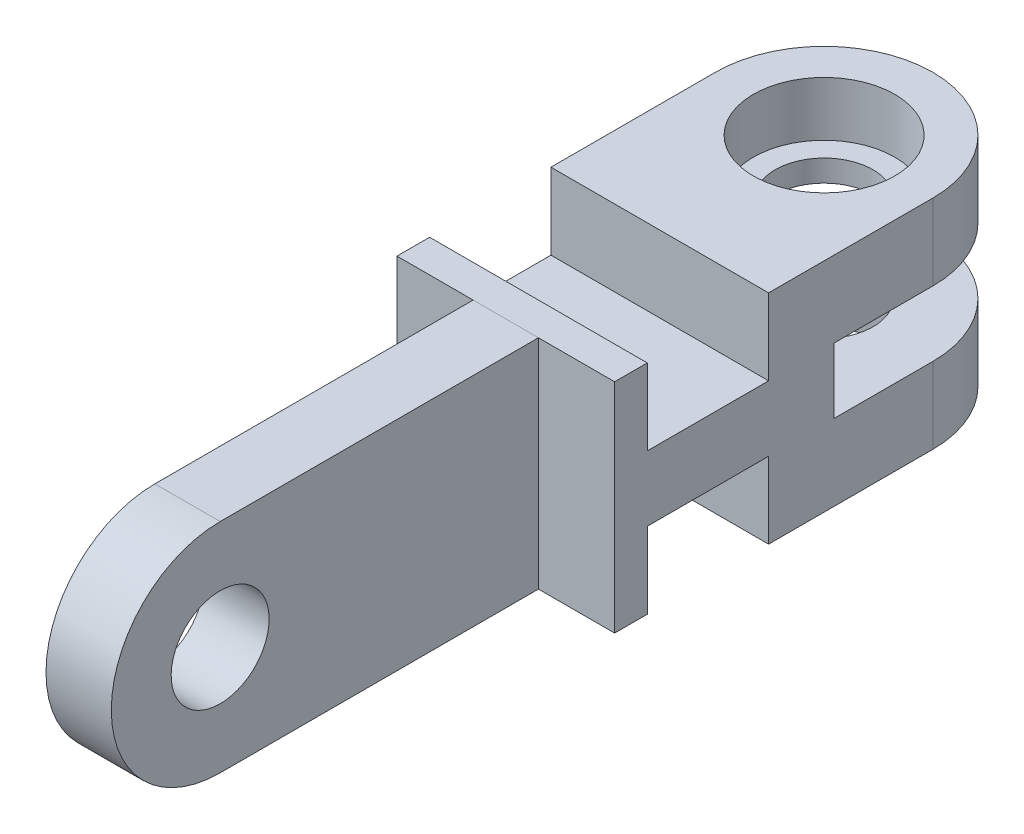
ISO-10303-21;
HEADER;
FILE_DESCRIPTION(('STEP AP214'),'2;1');
FILE_NAME('part.step','',(''),(''),'','','');
FILE_SCHEMA(('AUTOMOTIVE_DESIGN { 1 0 10303 214 1 1 1 1 }'));
ENDSEC;
DATA;
#1=APPLICATION_CONTEXT('core data for automotive mechanical design processes');
#2=APPLICATION_PROTOCOL_DEFINITION('international standard','automotive_design',2000,#1);
#3=PRODUCT_CONTEXT('',#1,'mechanical');
#4=PRODUCT('Part','Part','',(#3));
#5=PRODUCT_RELATED_PRODUCT_CATEGORY('part','',(#4));
#6=PRODUCT_DEFINITION_FORMATION('','',#4);
#7=PRODUCT_DEFINITION_CONTEXT('part definition',#1,'design');
#8=PRODUCT_DEFINITION('design','',#6,#7);
#9=PRODUCT_DEFINITION_SHAPE('','',#8);
#10=(LENGTH_UNIT() NAMED_UNIT(*) SI_UNIT(.MILLI.,.METRE.));
#11=(NAMED_UNIT(*) PLANE_ANGLE_UNIT() SI_UNIT($,.RADIAN.));
#12=(NAMED_UNIT(*) SI_UNIT($,.STERADIAN.) SOLID_ANGLE_UNIT());
#13=UNCERTAINTY_MEASURE_WITH_UNIT(LENGTH_MEASURE(1.E-05),#10,'distance_accuracy_value','');
#14=(GEOMETRIC_REPRESENTATION_CONTEXT(3) GLOBAL_UNCERTAINTY_ASSIGNED_CONTEXT((#13)) GLOBAL_UNIT_ASSIGNED_CONTEXT((#10,
#11,#12)) REPRESENTATION_CONTEXT('',''));
#15=CARTESIAN_POINT('',(0.,0.,0.));
#16=DIRECTION('',(0.,0.,1.));
#17=DIRECTION('',(1.,0.,0.));
#18=AXIS2_PLACEMENT_3D('',#15,#16,#17);
#19=CARTESIAN_POINT('',(-19.,0.,69.3946812691347));
#20=DIRECTION('',(1.,0.,0.));
#21=DIRECTION('',(0.,0.,-1.));
#22=AXIS2_PLACEMENT_3D('',#19,#20,#21);
#23=CYLINDRICAL_SURFACE('',#22,4.5);
#24=CARTESIAN_POINT('',(3.,0.,69.3946812691347));
#25=DIRECTION('',(-1.,0.,0.));
#26=DIRECTION('',(0.,-1.,0.));
#27=AXIS2_PLACEMENT_3D('',#24,#25,#26);
#28=CIRCLE('',#27,4.5);
#29=CARTESIAN_POINT('',(3.00000000000002,-4.49999999999999,69.3946812691347));
#30=VERTEX_POINT('',#29);
#31=EDGE_CURVE('E84',#30,#30,#28,.T.);
#32=ORIENTED_EDGE('',*,*,#31,.F.);
#33=EDGE_LOOP('',(#32));
#34=FACE_BOUND('',#33,.T.);
#35=CARTESIAN_POINT('',(-3.,0.,69.3946812691347));
#36=DIRECTION('',(1.,0.,0.));
#37=DIRECTION('',(0.,1.,0.));
#38=AXIS2_PLACEMENT_3D('',#35,#36,#37);
#39=CIRCLE('',#38,4.5);
#40=CARTESIAN_POINT('',(-3.00000000000002,4.49999999999999,69.3946812691347));
#41=VERTEX_POINT('',#40);
#42=EDGE_CURVE('E134',#41,#41,#39,.T.);
#43=ORIENTED_EDGE('',*,*,#42,.F.);
#44=EDGE_LOOP('',(#43));
#45=FACE_BOUND('',#44,.T.);
#46=ADVANCED_FACE('F80',(#34,#45),#23,.F.);
#47=CARTESIAN_POINT('',(-3.00000000000009,24.,79.3946812691347));
#48=DIRECTION('',(1.,0.,0.));
#49=DIRECTION('',(0.,1.,0.));
#50=AXIS2_PLACEMENT_3D('',#47,#48,#49);
#51=PLANE('',#50);
#52=ORIENTED_EDGE('',*,*,#42,.T.);
#53=EDGE_LOOP('',(#52));
#54=FACE_BOUND('',#53,.T.);
#55=CARTESIAN_POINT('',(-3.,0.,69.3946812691347));
#56=DIRECTION('',(1.,0.,0.));
#57=DIRECTION('',(0.,1.,0.));
#58=AXIS2_PLACEMENT_3D('',#55,#56,#57);
#59=CIRCLE('',#58,10.);
#60=CARTESIAN_POINT('',(-3.00000000000004,9.99999999999999,69.3946812691347));
#61=VERTEX_POINT('',#60);
#62=CARTESIAN_POINT('',(-2.99999999999997,-10.,69.3946812691347));
#63=VERTEX_POINT('',#62);
#64=EDGE_CURVE('E148',#61,#63,#59,.T.);
#65=ORIENTED_EDGE('',*,*,#64,.F.);
#66=DIRECTION('',(0.,0.,1.));
#67=VECTOR('',#66,1.);
#68=CARTESIAN_POINT('',(-3.00000000000004,9.99999999999999,80.297387422123));
#69=LINE('',#68,#67);
#70=CARTESIAN_POINT('',(-3.00000000000004,9.99999999999998,40.1486937110615));
#71=VERTEX_POINT('',#70);
#72=EDGE_CURVE('E144',#71,#61,#69,.T.);
#73=ORIENTED_EDGE('',*,*,#72,.F.);
#74=DIRECTION('',(0.,-1.,0.));
#75=VECTOR('',#74,1.);
#76=CARTESIAN_POINT('',(-3.00000000000009,24.,40.1486937110615));
#77=LINE('',#76,#75);
#78=CARTESIAN_POINT('',(-2.99999999999997,-10.,40.1486937110615));
#79=VERTEX_POINT('',#78);
#80=EDGE_CURVE('E105',#71,#79,#77,.T.);
#81=ORIENTED_EDGE('',*,*,#80,.T.);
#82=DIRECTION('',(0.,0.,1.));
#83=VECTOR('',#82,1.);
#84=CARTESIAN_POINT('',(-2.99999999999996,-10.,79.3946812691347));
#85=LINE('',#84,#83);
#86=EDGE_CURVE('E137',#79,#63,#85,.T.);
#87=ORIENTED_EDGE('',*,*,#86,.T.);
#88=EDGE_LOOP('',(#65,#73,#81,#87));
#89=FACE_BOUND('',#88,.T.);
#90=ADVANCED_FACE('F162',(#54,#89),#51,.F.);
#91=CARTESIAN_POINT('',(2.99999999999992,24.,79.3946812691347));
#92=DIRECTION('',(-1.,0.,0.));
#93=DIRECTION('',(0.,-1.,0.));
#94=AXIS2_PLACEMENT_3D('',#91,#92,#93);
#95=PLANE('',#94);
#96=ORIENTED_EDGE('',*,*,#31,.T.);
#97=EDGE_LOOP('',(#96));
#98=FACE_BOUND('',#97,.T.);
#99=DIRECTION('',(0.,0.,-1.));
#100=VECTOR('',#99,1.);
#101=CARTESIAN_POINT('',(3.00000000000004,-9.99999999999999,79.3946812691347));
#102=LINE('',#101,#100);
#103=CARTESIAN_POINT('',(3.00000000000004,-9.99999999999999,69.3946812691347));
#104=VERTEX_POINT('',#103);
#105=CARTESIAN_POINT('',(3.00000000000004,-9.99999999999999,40.1486937110615));
#106=VERTEX_POINT('',#105);
#107=EDGE_CURVE('E121',#104,#106,#102,.T.);
#108=ORIENTED_EDGE('',*,*,#107,.T.);
#109=DIRECTION('',(0.,-1.,0.));
#110=VECTOR('',#109,1.);
#111=CARTESIAN_POINT('',(2.99999999999992,24.,40.1486937110615));
#112=LINE('',#111,#110);
#113=CARTESIAN_POINT('',(2.99999999999997,10.,40.1486937110615));
#114=VERTEX_POINT('',#113);
#115=EDGE_CURVE('E124',#114,#106,#112,.T.);
#116=ORIENTED_EDGE('',*,*,#115,.F.);
#117=DIRECTION('',(0.,0.,-1.));
#118=VECTOR('',#117,1.);
#119=CARTESIAN_POINT('',(2.99999999999996,10.,80.297387422123));
#120=LINE('',#119,#118);
#121=CARTESIAN_POINT('',(2.99999999999997,10.,69.3946812691347));
#122=VERTEX_POINT('',#121);
#123=EDGE_CURVE('E157',#122,#114,#120,.T.);
#124=ORIENTED_EDGE('',*,*,#123,.F.);
#125=CARTESIAN_POINT('',(3.,0.,69.3946812691347));
#126=DIRECTION('',(-1.,0.,0.));
#127=DIRECTION('',(0.,-1.,0.));
#128=AXIS2_PLACEMENT_3D('',#125,#126,#127);
#129=CIRCLE('',#128,10.);
#130=EDGE_CURVE('E97',#104,#122,#129,.T.);
#131=ORIENTED_EDGE('',*,*,#130,.F.);
#132=EDGE_LOOP('',(#108,#116,#124,#131));
#133=FACE_BOUND('',#132,.T.);
#134=ADVANCED_FACE('F123',(#98,#133),#95,.F.);
#135=CARTESIAN_POINT('',(0.,0.,40.1486937110615));
#136=DIRECTION('',(0.,0.,1.));
#137=DIRECTION('',(0.,1.,0.));
#138=AXIS2_PLACEMENT_3D('',#135,#136,#137);
#139=PLANE('',#138);
#140=DIRECTION('',(-1.,0.,0.));
#141=VECTOR('',#140,1.);
#142=CARTESIAN_POINT('',(-10.,9.99999999999997,40.1486937110615));
#143=LINE('',#142,#141);
#144=EDGE_CURVE('E14',#114,#71,#143,.T.);
#145=ORIENTED_EDGE('',*,*,#144,.F.);
#146=ORIENTED_EDGE('',*,*,#115,.T.);
#147=DIRECTION('',(1.,0.,0.));
#148=VECTOR('',#147,1.);
#149=CARTESIAN_POINT('',(-9.99999999999996,-10.,40.1486937110615));
#150=LINE('',#149,#148);
#151=EDGE_CURVE('E89',#79,#106,#150,.T.);
#152=ORIENTED_EDGE('',*,*,#151,.F.);
#153=ORIENTED_EDGE('',*,*,#80,.F.);
#154=EDGE_LOOP('',(#145,#146,#152,#153));
#155=FACE_BOUND('',#154,.T.);
#156=ADVANCED_FACE('F82',(#155),#139,.F.);
#157=CARTESIAN_POINT('',(-19.,0.,69.3946812691347));
#158=DIRECTION('',(1.,0.,0.));
#159=DIRECTION('',(0.,0.,-1.));
#160=AXIS2_PLACEMENT_3D('',#157,#158,#159);
#161=CYLINDRICAL_SURFACE('',#160,10.);
#162=DIRECTION('',(1.,0.,0.));
#163=VECTOR('',#162,1.);
#164=CARTESIAN_POINT('',(-19.,-10.0000000000001,69.3946812691347));
#165=LINE('',#164,#163);
#166=EDGE_CURVE('E138',#63,#104,#165,.T.);
#167=ORIENTED_EDGE('',*,*,#166,.T.);
#168=ORIENTED_EDGE('',*,*,#130,.T.);
#169=DIRECTION('',(1.,0.,0.));
#170=VECTOR('',#169,1.);
#171=CARTESIAN_POINT('',(-19.,9.99999999999993,69.3946812691347));
#172=LINE('',#171,#170);
#173=EDGE_CURVE('E140',#61,#122,#172,.T.);
#174=ORIENTED_EDGE('',*,*,#173,.F.);
#175=ORIENTED_EDGE('',*,*,#64,.T.);
#176=EDGE_LOOP('',(#167,#168,#174,#175));
#177=FACE_BOUND('',#176,.T.);
#178=ADVANCED_FACE('F161',(#177),#161,.T.);
#179=CARTESIAN_POINT('',(-10.,9.99999999999997,80.297387422123));
#180=DIRECTION('',(0.,-1.,0.));
#181=DIRECTION('',(1.,0.,0.));
#182=AXIS2_PLACEMENT_3D('',#179,#180,#181);
#183=PLANE('',#182);
#184=ORIENTED_EDGE('',*,*,#173,.T.);
#185=ORIENTED_EDGE('',*,*,#123,.T.);
#186=ORIENTED_EDGE('',*,*,#144,.T.);
#187=ORIENTED_EDGE('',*,*,#72,.T.);
#188=EDGE_LOOP('',(#184,#185,#186,#187));
#189=FACE_BOUND('',#188,.T.);
#190=ADVANCED_FACE('F159',(#189),#183,.F.);
#191=CARTESIAN_POINT('',(-9.99999999999996,-10.,80.297387422123));
#192=DIRECTION('',(0.,1.,0.));
#193=DIRECTION('',(-1.,0.,0.));
#194=AXIS2_PLACEMENT_3D('',#191,#192,#193);
#195=PLANE('',#194);
#196=ORIENTED_EDGE('',*,*,#151,.T.);
#197=ORIENTED_EDGE('',*,*,#107,.F.);
#198=ORIENTED_EDGE('',*,*,#166,.F.);
#199=ORIENTED_EDGE('',*,*,#86,.F.);
#200=EDGE_LOOP('',(#196,#197,#198,#199));
#201=FACE_BOUND('',#200,.T.);
#202=ADVANCED_FACE('F136',(#201),#195,.F.);
#203=CLOSED_SHELL('',(#46,#90,#134,#156,#178,#190,#202));
#204=MANIFOLD_SOLID_BREP('B2',#203);
#205=CARTESIAN_POINT('',(0.,0.,40.1486937110615));
#206=DIRECTION('',(0.,0.,1.));
#207=DIRECTION('',(1.,0.,0.));
#208=AXIS2_PLACEMENT_3D('',#205,#206,#207);
#209=PLANE('',#208);
#210=DIRECTION('',(1.,0.,0.));
#211=VECTOR('',#210,1.);
#212=CARTESIAN_POINT('',(-10.,-10.,40.1486937110615));
#213=LINE('',#212,#211);
#214=CARTESIAN_POINT('',(-10.,-10.,40.1486937110615));
#215=VERTEX_POINT('',#214);
#216=CARTESIAN_POINT('',(10.,-10.,40.1486937110615));
#217=VERTEX_POINT('',#216);
#218=EDGE_CURVE('E228',#215,#217,#213,.T.);
#219=ORIENTED_EDGE('',*,*,#218,.T.);
#220=DIRECTION('',(0.,1.,0.));
#221=VECTOR('',#220,1.);
#222=CARTESIAN_POINT('',(10.,10.,40.1486937110615));
#223=LINE('',#222,#221);
#224=CARTESIAN_POINT('',(10.,10.,40.1486937110615));
#225=VERTEX_POINT('',#224);
#226=EDGE_CURVE('E339',#217,#225,#223,.T.);
#227=ORIENTED_EDGE('',*,*,#226,.T.);
#228=DIRECTION('',(-1.,0.,0.));
#229=VECTOR('',#228,1.);
#230=CARTESIAN_POINT('',(-10.,10.,40.1486937110615));
#231=LINE('',#230,#229);
#232=CARTESIAN_POINT('',(-10.,10.,40.1486937110615));
#233=VERTEX_POINT('',#232);
#234=EDGE_CURVE('E362',#225,#233,#231,.T.);
#235=ORIENTED_EDGE('',*,*,#234,.T.);
#236=DIRECTION('',(0.,-1.,0.));
#237=VECTOR('',#236,1.);
#238=CARTESIAN_POINT('',(-10.,10.,40.1486937110615));
#239=LINE('',#238,#237);
#240=EDGE_CURVE('E342',#233,#215,#239,.T.);
#241=ORIENTED_EDGE('',*,*,#240,.T.);
#242=EDGE_LOOP('',(#219,#227,#235,#241));
#243=FACE_BOUND('',#242,.T.);
#244=ADVANCED_FACE('F225',(#243),#209,.T.);
#245=CARTESIAN_POINT('',(10.,10.,80.297387422123));
#246=DIRECTION('',(-1.,0.,0.));
#247=DIRECTION('',(0.,-1.,0.));
#248=AXIS2_PLACEMENT_3D('',#245,#246,#247);
#249=PLANE('',#248);
#250=ORIENTED_EDGE('',*,*,#226,.F.);
#251=DIRECTION('',(0.,0.,-1.));
#252=VECTOR('',#251,1.);
#253=CARTESIAN_POINT('',(10.,-10.,80.297387422123));
#254=LINE('',#253,#252);
#255=CARTESIAN_POINT('',(10.,-10.,37.1486937110615));
#256=VERTEX_POINT('',#255);
#257=EDGE_CURVE('E346',#217,#256,#254,.T.);
#258=ORIENTED_EDGE('',*,*,#257,.T.);
#259=DIRECTION('',(0.,-1.,0.));
#260=VECTOR('',#259,1.);
#261=CARTESIAN_POINT('',(10.,-10.,37.1486937110615));
#262=LINE('',#261,#260);
#263=CARTESIAN_POINT('',(10.,-3.00000000000001,37.1486937110615));
#264=VERTEX_POINT('',#263);
#265=EDGE_CURVE('E475',#264,#256,#262,.T.);
#266=ORIENTED_EDGE('',*,*,#265,.F.);
#267=DIRECTION('',(0.,0.,1.));
#268=VECTOR('',#267,1.);
#269=CARTESIAN_POINT('',(10.,-3.,26.));
#270=LINE('',#269,#268);
#271=CARTESIAN_POINT('',(10.,-3.,26.));
#272=VERTEX_POINT('',#271);
#273=EDGE_CURVE('E471',#272,#264,#270,.T.);
#274=ORIENTED_EDGE('',*,*,#273,.F.);
#275=DIRECTION('',(0.,1.,0.));
#276=VECTOR('',#275,1.);
#277=CARTESIAN_POINT('',(10.,-10.,26.));
#278=LINE('',#277,#276);
#279=CARTESIAN_POINT('',(10.,-10.,26.));
#280=VERTEX_POINT('',#279);
#281=EDGE_CURVE('E419',#280,#272,#278,.T.);
#282=ORIENTED_EDGE('',*,*,#281,.F.);
#283=CARTESIAN_POINT('',(10.,-10.,10.9027061529883));
#284=VERTEX_POINT('',#283);
#285=EDGE_CURVE('E354',#280,#284,#254,.T.);
#286=ORIENTED_EDGE('',*,*,#285,.T.);
#287=DIRECTION('',(0.,-1.,0.));
#288=VECTOR('',#287,1.);
#289=CARTESIAN_POINT('',(10.,19.,10.9027061529883));
#290=LINE('',#289,#288);
#291=CARTESIAN_POINT('',(10.,-3.,10.9027061529883));
#292=VERTEX_POINT('',#291);
#293=EDGE_CURVE('E242',#292,#284,#290,.T.);
#294=ORIENTED_EDGE('',*,*,#293,.F.);
#295=DIRECTION('',(0.,0.,-1.));
#296=VECTOR('',#295,1.);
#297=CARTESIAN_POINT('',(10.,-3.,20.));
#298=LINE('',#297,#296);
#299=CARTESIAN_POINT('',(10.,-3.,20.));
#300=VERTEX_POINT('',#299);
#301=EDGE_CURVE('E431',#300,#292,#298,.T.);
#302=ORIENTED_EDGE('',*,*,#301,.F.);
#303=DIRECTION('',(0.,-1.,0.));
#304=VECTOR('',#303,1.);
#305=CARTESIAN_POINT('',(10.,-3.,20.));
#306=LINE('',#305,#304);
#307=CARTESIAN_POINT('',(10.,3.,20.));
#308=VERTEX_POINT('',#307);
#309=EDGE_CURVE('E427',#308,#300,#306,.T.);
#310=ORIENTED_EDGE('',*,*,#309,.F.);
#311=DIRECTION('',(0.,0.,1.));
#312=VECTOR('',#311,1.);
#313=CARTESIAN_POINT('',(10.,3.,20.));
#314=LINE('',#313,#312);
#315=CARTESIAN_POINT('',(10.,3.,10.9027061529883));
#316=VERTEX_POINT('',#315);
#317=EDGE_CURVE('E423',#316,#308,#314,.T.);
#318=ORIENTED_EDGE('',*,*,#317,.F.);
#319=CARTESIAN_POINT('',(10.,10.,10.9027061529883));
#320=VERTEX_POINT('',#319);
#321=EDGE_CURVE('E386',#320,#316,#290,.T.);
#322=ORIENTED_EDGE('',*,*,#321,.F.);
#323=DIRECTION('',(0.,0.,-1.));
#324=VECTOR('',#323,1.);
#325=CARTESIAN_POINT('',(10.,10.,80.297387422123));
#326=LINE('',#325,#324);
#327=CARTESIAN_POINT('',(10.,10.,26.));
#328=VERTEX_POINT('',#327);
#329=EDGE_CURVE('E378',#328,#320,#326,.T.);
#330=ORIENTED_EDGE('',*,*,#329,.F.);
#331=DIRECTION('',(0.,1.,0.));
#332=VECTOR('',#331,1.);
#333=CARTESIAN_POINT('',(10.,10.,26.));
#334=LINE('',#333,#332);
#335=CARTESIAN_POINT('',(10.,3.,26.));
#336=VERTEX_POINT('',#335);
#337=EDGE_CURVE('E443',#336,#328,#334,.T.);
#338=ORIENTED_EDGE('',*,*,#337,.F.);
#339=DIRECTION('',(0.,0.,-1.));
#340=VECTOR('',#339,1.);
#341=CARTESIAN_POINT('',(10.,3.,26.));
#342=LINE('',#341,#340);
#343=CARTESIAN_POINT('',(10.,2.99999999999999,37.1486937110615));
#344=VERTEX_POINT('',#343);
#345=EDGE_CURVE('E451',#344,#336,#342,.T.);
#346=ORIENTED_EDGE('',*,*,#345,.F.);
#347=DIRECTION('',(0.,-1.,0.));
#348=VECTOR('',#347,1.);
#349=CARTESIAN_POINT('',(10.,10.,37.1486937110615));
#350=LINE('',#349,#348);
#351=CARTESIAN_POINT('',(10.,10.,37.1486937110615));
#352=VERTEX_POINT('',#351);
#353=EDGE_CURVE('E447',#352,#344,#350,.T.);
#354=ORIENTED_EDGE('',*,*,#353,.F.);
#355=EDGE_CURVE('E359',#225,#352,#326,.T.);
#356=ORIENTED_EDGE('',*,*,#355,.F.);
#357=EDGE_LOOP('',(#250,#258,#266,#274,#282,#286,#294,#302,#310,#318,#322,#330,#338,#346,#354,#356));
#358=FACE_BOUND('',#357,.T.);
#359=ADVANCED_FACE('F357',(#358),#249,.F.);
#360=CARTESIAN_POINT('',(-10.,10.,80.297387422123));
#361=DIRECTION('',(0.,-1.,0.));
#362=DIRECTION('',(1.,0.,0.));
#363=AXIS2_PLACEMENT_3D('',#360,#361,#362);
#364=PLANE('',#363);
#365=ORIENTED_EDGE('',*,*,#234,.F.);
#366=ORIENTED_EDGE('',*,*,#355,.T.);
#367=DIRECTION('',(1.,0.,0.));
#368=VECTOR('',#367,1.);
#369=CARTESIAN_POINT('',(-24.,10.,37.1486937110615));
#370=LINE('',#369,#368);
#371=CARTESIAN_POINT('',(-10.,10.,37.1486937110615));
#372=VERTEX_POINT('',#371);
#373=EDGE_CURVE('E461',#372,#352,#370,.T.);
#374=ORIENTED_EDGE('',*,*,#373,.F.);
#375=DIRECTION('',(0.,0.,-1.));
#376=VECTOR('',#375,1.);
#377=CARTESIAN_POINT('',(-10.,10.,80.297387422123));
#378=LINE('',#377,#376);
#379=EDGE_CURVE('E375',#233,#372,#378,.T.);
#380=ORIENTED_EDGE('',*,*,#379,.F.);
#381=EDGE_LOOP('',(#365,#366,#374,#380));
#382=FACE_BOUND('',#381,.T.);
#383=ADVANCED_FACE('F583',(#382),#364,.F.);
#384=CARTESIAN_POINT('',(-10.,10.,80.297387422123));
#385=DIRECTION('',(1.,0.,0.));
#386=DIRECTION('',(0.,1.,0.));
#387=AXIS2_PLACEMENT_3D('',#384,#385,#386);
#388=PLANE('',#387);
#389=ORIENTED_EDGE('',*,*,#240,.F.);
#390=ORIENTED_EDGE('',*,*,#379,.T.);
#391=DIRECTION('',(0.,-1.,0.));
#392=VECTOR('',#391,1.);
#393=CARTESIAN_POINT('',(-10.,10.,37.1486937110615));
#394=LINE('',#393,#392);
#395=CARTESIAN_POINT('',(-10.,2.99999999999999,37.1486937110615));
#396=VERTEX_POINT('',#395);
#397=EDGE_CURVE('E507',#372,#396,#394,.T.);
#398=ORIENTED_EDGE('',*,*,#397,.T.);
#399=DIRECTION('',(0.,0.,-1.));
#400=VECTOR('',#399,1.);
#401=CARTESIAN_POINT('',(-10.,2.99999999999999,80.297387422123));
#402=LINE('',#401,#400);
#403=CARTESIAN_POINT('',(-10.,2.99999999999999,26.));
#404=VERTEX_POINT('',#403);
#405=EDGE_CURVE('E511',#396,#404,#402,.T.);
#406=ORIENTED_EDGE('',*,*,#405,.T.);
#407=DIRECTION('',(0.,1.,0.));
#408=VECTOR('',#407,1.);
#409=CARTESIAN_POINT('',(-10.,10.,26.));
#410=LINE('',#409,#408);
#411=CARTESIAN_POINT('',(-10.,10.,26.));
#412=VERTEX_POINT('',#411);
#413=EDGE_CURVE('E515',#404,#412,#410,.T.);
#414=ORIENTED_EDGE('',*,*,#413,.T.);
#415=CARTESIAN_POINT('',(-10.,10.,10.9027061529883));
#416=VERTEX_POINT('',#415);
#417=EDGE_CURVE('E374',#412,#416,#378,.T.);
#418=ORIENTED_EDGE('',*,*,#417,.T.);
#419=DIRECTION('',(0.,-1.,0.));
#420=VECTOR('',#419,1.);
#421=CARTESIAN_POINT('',(-10.,19.,10.9027061529883));
#422=LINE('',#421,#420);
#423=CARTESIAN_POINT('',(-10.,3.,10.9027061529883));
#424=VERTEX_POINT('',#423);
#425=EDGE_CURVE('E383',#416,#424,#422,.T.);
#426=ORIENTED_EDGE('',*,*,#425,.T.);
#427=DIRECTION('',(0.,0.,1.));
#428=VECTOR('',#427,1.);
#429=CARTESIAN_POINT('',(-10.,3.00000000000001,80.297387422123));
#430=LINE('',#429,#428);
#431=CARTESIAN_POINT('',(-10.,3.,20.));
#432=VERTEX_POINT('',#431);
#433=EDGE_CURVE('E439',#424,#432,#430,.T.);
#434=ORIENTED_EDGE('',*,*,#433,.T.);
#435=DIRECTION('',(0.,-1.,0.));
#436=VECTOR('',#435,1.);
#437=CARTESIAN_POINT('',(-10.,10.,20.));
#438=LINE('',#437,#436);
#439=CARTESIAN_POINT('',(-10.,-3.,20.));
#440=VERTEX_POINT('',#439);
#441=EDGE_CURVE('E366',#432,#440,#438,.T.);
#442=ORIENTED_EDGE('',*,*,#441,.T.);
#443=DIRECTION('',(0.,0.,-1.));
#444=VECTOR('',#443,1.);
#445=CARTESIAN_POINT('',(-10.,-2.99999999999999,80.297387422123));
#446=LINE('',#445,#444);
#447=CARTESIAN_POINT('',(-10.,-3.,10.9027061529883));
#448=VERTEX_POINT('',#447);
#449=EDGE_CURVE('E485',#440,#448,#446,.T.);
#450=ORIENTED_EDGE('',*,*,#449,.T.);
#451=CARTESIAN_POINT('',(-10.,-10.,10.9027061529883));
#452=VERTEX_POINT('',#451);
#453=EDGE_CURVE('E234',#448,#452,#422,.T.);
#454=ORIENTED_EDGE('',*,*,#453,.T.);
#455=DIRECTION('',(0.,0.,-1.));
#456=VECTOR('',#455,1.);
#457=CARTESIAN_POINT('',(-10.,-10.,80.297387422123));
#458=LINE('',#457,#456);
#459=CARTESIAN_POINT('',(-10.,-10.,26.));
#460=VERTEX_POINT('',#459);
#461=EDGE_CURVE('E355',#460,#452,#458,.T.);
#462=ORIENTED_EDGE('',*,*,#461,.F.);
#463=DIRECTION('',(0.,1.,0.));
#464=VECTOR('',#463,1.);
#465=CARTESIAN_POINT('',(-10.,9.99999999999997,26.));
#466=LINE('',#465,#464);
#467=CARTESIAN_POINT('',(-10.,-3.00000000000001,26.));
#468=VERTEX_POINT('',#467);
#469=EDGE_CURVE('E493',#460,#468,#466,.T.);
#470=ORIENTED_EDGE('',*,*,#469,.T.);
#471=DIRECTION('',(0.,0.,1.));
#472=VECTOR('',#471,1.);
#473=CARTESIAN_POINT('',(-10.,-3.00000000000001,80.297387422123));
#474=LINE('',#473,#472);
#475=CARTESIAN_POINT('',(-10.,-3.00000000000001,37.1486937110615));
#476=VERTEX_POINT('',#475);
#477=EDGE_CURVE('E503',#468,#476,#474,.T.);
#478=ORIENTED_EDGE('',*,*,#477,.T.);
#479=DIRECTION('',(0.,-1.,0.));
#480=VECTOR('',#479,1.);
#481=CARTESIAN_POINT('',(-10.,10.,37.1486937110615));
#482=LINE('',#481,#480);
#483=CARTESIAN_POINT('',(-10.,-10.,37.1486937110615));
#484=VERTEX_POINT('',#483);
#485=EDGE_CURVE('E489',#476,#484,#482,.T.);
#486=ORIENTED_EDGE('',*,*,#485,.T.);
#487=EDGE_CURVE('E371',#215,#484,#458,.T.);
#488=ORIENTED_EDGE('',*,*,#487,.F.);
#489=EDGE_LOOP('',(#389,#390,#398,#406,#414,#418,#426,#434,#442,#450,#454,#462,#470,#478,#486,#488));
#490=FACE_BOUND('',#489,.T.);
#491=ADVANCED_FACE('F547',(#490),#388,.F.);
#492=CARTESIAN_POINT('',(-10.,-10.,80.297387422123));
#493=DIRECTION('',(0.,1.,0.));
#494=DIRECTION('',(0.,0.,1.));
#495=AXIS2_PLACEMENT_3D('',#492,#493,#494);
#496=PLANE('',#495);
#497=ORIENTED_EDGE('',*,*,#218,.F.);
#498=ORIENTED_EDGE('',*,*,#487,.T.);
#499=DIRECTION('',(1.,0.,0.));
#500=VECTOR('',#499,1.);
#501=CARTESIAN_POINT('',(-10.,-10.,37.1486937110615));
#502=LINE('',#501,#500);
#503=EDGE_CURVE('E349',#484,#256,#502,.T.);
#504=ORIENTED_EDGE('',*,*,#503,.T.);
#505=ORIENTED_EDGE('',*,*,#257,.F.);
#506=EDGE_LOOP('',(#497,#498,#504,#505));
#507=FACE_BOUND('',#506,.T.);
#508=ADVANCED_FACE('F347',(#507),#496,.F.);
#509=CARTESIAN_POINT('',(0.,10.,10.9027061529883));
#510=DIRECTION('',(0.,-1.,0.));
#511=DIRECTION('',(0.,0.,-1.));
#512=AXIS2_PLACEMENT_3D('',#509,#510,#511);
#513=CIRCLE('',#512,6.5);
#514=CARTESIAN_POINT('',(0.,10.,4.40270615298831));
#515=VERTEX_POINT('',#514);
#516=EDGE_CURVE('E406',#515,#515,#513,.T.);
#517=ORIENTED_EDGE('',*,*,#516,.T.);
#518=EDGE_LOOP('',(#517));
#519=FACE_BOUND('',#518,.T.);
#520=CARTESIAN_POINT('',(0.,10.,10.9027061529883));
#521=DIRECTION('',(0.,-1.,0.));
#522=DIRECTION('',(1.,0.,0.));
#523=AXIS2_PLACEMENT_3D('',#520,#521,#522);
#524=CIRCLE('',#523,10.);
#525=EDGE_CURVE('E403',#416,#320,#524,.T.);
#526=ORIENTED_EDGE('',*,*,#525,.F.);
#527=ORIENTED_EDGE('',*,*,#417,.F.);
#528=DIRECTION('',(1.,0.,0.));
#529=VECTOR('',#528,1.);
#530=CARTESIAN_POINT('',(-24.,10.,26.));
#531=LINE('',#530,#529);
#532=EDGE_CURVE('E455',#412,#328,#531,.T.);
#533=ORIENTED_EDGE('',*,*,#532,.T.);
#534=ORIENTED_EDGE('',*,*,#329,.T.);
#535=EDGE_LOOP('',(#526,#527,#533,#534));
#536=FACE_BOUND('',#535,.T.);
#537=ADVANCED_FACE('F552',(#519,#536),#364,.F.);
#538=CARTESIAN_POINT('',(0.,-10.,10.9027061529883));
#539=DIRECTION('',(0.,-1.,0.));
#540=DIRECTION('',(0.,0.,-1.));
#541=AXIS2_PLACEMENT_3D('',#538,#539,#540);
#542=CIRCLE('',#541,6.5);
#543=CARTESIAN_POINT('',(0.,-10.,4.40270615298831));
#544=VERTEX_POINT('',#543);
#545=EDGE_CURVE('E411',#544,#544,#542,.T.);
#546=ORIENTED_EDGE('',*,*,#545,.F.);
#547=EDGE_LOOP('',(#546));
#548=FACE_BOUND('',#547,.T.);
#549=CARTESIAN_POINT('',(0.,-10.,10.9027061529883));
#550=DIRECTION('',(0.,-1.,0.));
#551=DIRECTION('',(0.,0.,-1.));
#552=AXIS2_PLACEMENT_3D('',#549,#550,#551);
#553=CIRCLE('',#552,10.);
#554=EDGE_CURVE('E78',#452,#284,#553,.T.);
#555=ORIENTED_EDGE('',*,*,#554,.T.);
#556=ORIENTED_EDGE('',*,*,#285,.F.);
#557=DIRECTION('',(-1.,0.,0.));
#558=VECTOR('',#557,1.);
#559=CARTESIAN_POINT('',(-10.,-10.,26.));
#560=LINE('',#559,#558);
#561=EDGE_CURVE('E499',#280,#460,#560,.T.);
#562=ORIENTED_EDGE('',*,*,#561,.T.);
#563=ORIENTED_EDGE('',*,*,#461,.T.);
#564=EDGE_LOOP('',(#555,#556,#562,#563));
#565=FACE_BOUND('',#564,.T.);
#566=ADVANCED_FACE('F564',(#548,#565),#496,.F.);
#567=CARTESIAN_POINT('',(-24.,-3.,20.));
#568=DIRECTION('',(0.,-1.,0.));
#569=DIRECTION('',(0.,0.,-1.));
#570=AXIS2_PLACEMENT_3D('',#567,#568,#569);
#571=PLANE('',#570);
#572=CARTESIAN_POINT('',(0.,-3.,10.9027061529883));
#573=DIRECTION('',(0.,-1.,0.));
#574=DIRECTION('',(0.,0.,-1.));
#575=AXIS2_PLACEMENT_3D('',#572,#573,#574);
#576=CIRCLE('',#575,4.5);
#577=CARTESIAN_POINT('',(0.,-3.,6.40270615298831));
#578=VERTEX_POINT('',#577);
#579=EDGE_CURVE('E396',#578,#578,#576,.T.);
#580=ORIENTED_EDGE('',*,*,#579,.T.);
#581=EDGE_LOOP('',(#580));
#582=FACE_BOUND('',#581,.T.);
#583=CARTESIAN_POINT('',(0.,-3.,10.9027061529883));
#584=DIRECTION('',(0.,-1.,0.));
#585=DIRECTION('',(0.,0.,-1.));
#586=AXIS2_PLACEMENT_3D('',#583,#584,#585);
#587=CIRCLE('',#586,10.);
#588=EDGE_CURVE('E400',#448,#292,#587,.T.);
#589=ORIENTED_EDGE('',*,*,#588,.F.);
#590=ORIENTED_EDGE('',*,*,#449,.F.);
#591=DIRECTION('',(1.,0.,0.));
#592=VECTOR('',#591,1.);
#593=CARTESIAN_POINT('',(-24.,-3.,20.));
#594=LINE('',#593,#592);
#595=EDGE_CURVE('E436',#440,#300,#594,.T.);
#596=ORIENTED_EDGE('',*,*,#595,.T.);
#597=ORIENTED_EDGE('',*,*,#301,.T.);
#598=EDGE_LOOP('',(#589,#590,#596,#597));
#599=FACE_BOUND('',#598,.T.);
#600=ADVANCED_FACE('F569',(#582,#599),#571,.F.);
#601=CARTESIAN_POINT('',(-24.,3.,20.));
#602=DIRECTION('',(0.,1.,0.));
#603=DIRECTION('',(0.,0.,1.));
#604=AXIS2_PLACEMENT_3D('',#601,#602,#603);
#605=PLANE('',#604);
#606=CARTESIAN_POINT('',(0.,3.,10.9027061529883));
#607=DIRECTION('',(0.,1.,0.));
#608=DIRECTION('',(0.,0.,1.));
#609=AXIS2_PLACEMENT_3D('',#606,#607,#608);
#610=CIRCLE('',#609,4.5);
#611=CARTESIAN_POINT('',(0.,3.,15.4027061529883));
#612=VERTEX_POINT('',#611);
#613=EDGE_CURVE('E392',#612,#612,#610,.T.);
#614=ORIENTED_EDGE('',*,*,#613,.T.);
#615=EDGE_LOOP('',(#614));
#616=FACE_BOUND('',#615,.T.);
#617=CARTESIAN_POINT('',(0.,3.,10.9027061529883));
#618=DIRECTION('',(0.,1.,0.));
#619=DIRECTION('',(0.,0.,1.));
#620=AXIS2_PLACEMENT_3D('',#617,#618,#619);
#621=CIRCLE('',#620,10.);
#622=EDGE_CURVE('E361',#316,#424,#621,.T.);
#623=ORIENTED_EDGE('',*,*,#622,.F.);
#624=ORIENTED_EDGE('',*,*,#317,.T.);
#625=DIRECTION('',(1.,0.,0.));
#626=VECTOR('',#625,1.);
#627=CARTESIAN_POINT('',(-24.,3.,20.));
#628=LINE('',#627,#626);
#629=EDGE_CURVE('E435',#432,#308,#628,.T.);
#630=ORIENTED_EDGE('',*,*,#629,.F.);
#631=ORIENTED_EDGE('',*,*,#433,.F.);
#632=EDGE_LOOP('',(#623,#624,#630,#631));
#633=FACE_BOUND('',#632,.T.);
#634=ADVANCED_FACE('F538',(#616,#633),#605,.F.);
#635=CARTESIAN_POINT('',(-24.,-3.,20.));
#636=DIRECTION('',(0.,0.,1.));
#637=DIRECTION('',(1.,0.,0.));
#638=AXIS2_PLACEMENT_3D('',#635,#636,#637);
#639=PLANE('',#638);
#640=ORIENTED_EDGE('',*,*,#629,.T.);
#641=ORIENTED_EDGE('',*,*,#309,.T.);
#642=ORIENTED_EDGE('',*,*,#595,.F.);
#643=ORIENTED_EDGE('',*,*,#441,.F.);
#644=EDGE_LOOP('',(#640,#641,#642,#643));
#645=FACE_BOUND('',#644,.T.);
#646=ADVANCED_FACE('F544',(#645),#639,.F.);
#647=CARTESIAN_POINT('',(-24.,-3.00000000000001,26.));
#648=DIRECTION('',(0.,1.,0.));
#649=DIRECTION('',(0.,0.,1.));
#650=AXIS2_PLACEMENT_3D('',#647,#648,#649);
#651=PLANE('',#650);
#652=DIRECTION('',(1.,0.,0.));
#653=VECTOR('',#652,1.);
#654=CARTESIAN_POINT('',(-24.,-3.00000000000001,26.));
#655=LINE('',#654,#653);
#656=EDGE_CURVE('E478',#468,#272,#655,.T.);
#657=ORIENTED_EDGE('',*,*,#656,.T.);
#658=ORIENTED_EDGE('',*,*,#273,.T.);
#659=DIRECTION('',(1.,0.,0.));
#660=VECTOR('',#659,1.);
#661=CARTESIAN_POINT('',(-24.,-3.00000000000001,37.1486937110615));
#662=LINE('',#661,#660);
#663=EDGE_CURVE('E446',#476,#264,#662,.T.);
#664=ORIENTED_EDGE('',*,*,#663,.F.);
#665=ORIENTED_EDGE('',*,*,#477,.F.);
#666=EDGE_LOOP('',(#657,#658,#664,#665));
#667=FACE_BOUND('',#666,.T.);
#668=ADVANCED_FACE('F652',(#667),#651,.F.);
#669=CARTESIAN_POINT('',(-24.,-10.,26.));
#670=DIRECTION('',(0.,0.,-1.));
#671=DIRECTION('',(0.,1.,0.));
#672=AXIS2_PLACEMENT_3D('',#669,#670,#671);
#673=PLANE('',#672);
#674=ORIENTED_EDGE('',*,*,#561,.F.);
#675=ORIENTED_EDGE('',*,*,#281,.T.);
#676=ORIENTED_EDGE('',*,*,#656,.F.);
#677=ORIENTED_EDGE('',*,*,#469,.F.);
#678=EDGE_LOOP('',(#674,#675,#676,#677));
#679=FACE_BOUND('',#678,.T.);
#680=ADVANCED_FACE('F656',(#679),#673,.F.);
#681=CARTESIAN_POINT('',(-24.,-10.,37.1486937110615));
#682=DIRECTION('',(0.,0.,1.));
#683=DIRECTION('',(1.,0.,0.));
#684=AXIS2_PLACEMENT_3D('',#681,#682,#683);
#685=PLANE('',#684);
#686=ORIENTED_EDGE('',*,*,#663,.T.);
#687=ORIENTED_EDGE('',*,*,#265,.T.);
#688=ORIENTED_EDGE('',*,*,#503,.F.);
#689=ORIENTED_EDGE('',*,*,#485,.F.);
#690=EDGE_LOOP('',(#686,#687,#688,#689));
#691=FACE_BOUND('',#690,.T.);
#692=ADVANCED_FACE('F662',(#691),#685,.F.);
#693=CARTESIAN_POINT('',(-24.,10.,26.));
#694=DIRECTION('',(0.,0.,-1.));
#695=DIRECTION('',(0.,1.,0.));
#696=AXIS2_PLACEMENT_3D('',#693,#694,#695);
#697=PLANE('',#696);
#698=DIRECTION('',(1.,0.,0.));
#699=VECTOR('',#698,1.);
#700=CARTESIAN_POINT('',(-24.,2.99999999999999,26.));
#701=LINE('',#700,#699);
#702=EDGE_CURVE('E426',#404,#336,#701,.T.);
#703=ORIENTED_EDGE('',*,*,#702,.T.);
#704=ORIENTED_EDGE('',*,*,#337,.T.);
#705=ORIENTED_EDGE('',*,*,#532,.F.);
#706=ORIENTED_EDGE('',*,*,#413,.F.);
#707=EDGE_LOOP('',(#703,#704,#705,#706));
#708=FACE_BOUND('',#707,.T.);
#709=ADVANCED_FACE('F646',(#708),#697,.F.);
#710=CARTESIAN_POINT('',(-24.,2.99999999999999,26.));
#711=DIRECTION('',(0.,-1.,0.));
#712=DIRECTION('',(1.,0.,0.));
#713=AXIS2_PLACEMENT_3D('',#710,#711,#712);
#714=PLANE('',#713);
#715=DIRECTION('',(1.,0.,0.));
#716=VECTOR('',#715,1.);
#717=CARTESIAN_POINT('',(-24.,2.99999999999999,37.1486937110615));
#718=LINE('',#717,#716);
#719=EDGE_CURVE('E458',#396,#344,#718,.T.);
#720=ORIENTED_EDGE('',*,*,#719,.T.);
#721=ORIENTED_EDGE('',*,*,#345,.T.);
#722=ORIENTED_EDGE('',*,*,#702,.F.);
#723=ORIENTED_EDGE('',*,*,#405,.F.);
#724=EDGE_LOOP('',(#720,#721,#722,#723));
#725=FACE_BOUND('',#724,.T.);
#726=ADVANCED_FACE('F640',(#725),#714,.F.);
#727=CARTESIAN_POINT('',(-24.,10.,37.1486937110615));
#728=DIRECTION('',(0.,0.,1.));
#729=DIRECTION('',(1.,0.,0.));
#730=AXIS2_PLACEMENT_3D('',#727,#728,#729);
#731=PLANE('',#730);
#732=ORIENTED_EDGE('',*,*,#373,.T.);
#733=ORIENTED_EDGE('',*,*,#353,.T.);
#734=ORIENTED_EDGE('',*,*,#719,.F.);
#735=ORIENTED_EDGE('',*,*,#397,.F.);
#736=EDGE_LOOP('',(#732,#733,#734,#735));
#737=FACE_BOUND('',#736,.T.);
#738=ADVANCED_FACE('F635',(#737),#731,.F.);
#739=CARTESIAN_POINT('',(0.,-5.,10.9027061529883));
#740=DIRECTION('',(0.,-1.,0.));
#741=DIRECTION('',(0.,0.,-1.));
#742=AXIS2_PLACEMENT_3D('',#739,#740,#741);
#743=CYLINDRICAL_SURFACE('',#742,6.5);
#744=CARTESIAN_POINT('',(0.,-5.,10.9027061529883));
#745=DIRECTION('',(0.,-1.,0.));
#746=DIRECTION('',(0.,0.,-1.));
#747=AXIS2_PLACEMENT_3D('',#744,#745,#746);
#748=CIRCLE('',#747,6.5);
#749=CARTESIAN_POINT('',(0.,-5.,4.40270615298831));
#750=VERTEX_POINT('',#749);
#751=EDGE_CURVE('E415',#750,#750,#748,.T.);
#752=ORIENTED_EDGE('',*,*,#751,.F.);
#753=EDGE_LOOP('',(#752));
#754=FACE_BOUND('',#753,.T.);
#755=ORIENTED_EDGE('',*,*,#545,.T.);
#756=EDGE_LOOP('',(#755));
#757=FACE_BOUND('',#756,.T.);
#758=ADVANCED_FACE('F616',(#754,#757),#743,.F.);
#759=CARTESIAN_POINT('',(0.,-5.,10.9027061529883));
#760=DIRECTION('',(0.,-1.,0.));
#761=DIRECTION('',(0.,0.,-1.));
#762=AXIS2_PLACEMENT_3D('',#759,#760,#761);
#763=PLANE('',#762);
#764=CARTESIAN_POINT('',(0.,-5.,10.9027061529883));
#765=DIRECTION('',(0.,-1.,0.));
#766=DIRECTION('',(0.,0.,-1.));
#767=AXIS2_PLACEMENT_3D('',#764,#765,#766);
#768=CIRCLE('',#767,4.5);
#769=CARTESIAN_POINT('',(0.,-5.,6.40270615298831));
#770=VERTEX_POINT('',#769);
#771=EDGE_CURVE('E387',#770,#770,#768,.T.);
#772=ORIENTED_EDGE('',*,*,#771,.F.);
#773=EDGE_LOOP('',(#772));
#774=FACE_BOUND('',#773,.T.);
#775=ORIENTED_EDGE('',*,*,#751,.T.);
#776=EDGE_LOOP('',(#775));
#777=FACE_BOUND('',#776,.T.);
#778=ADVANCED_FACE('F606',(#774,#777),#763,.T.);
#779=CARTESIAN_POINT('',(0.,5.,10.9027061529883));
#780=DIRECTION('',(0.,1.,0.));
#781=DIRECTION('',(0.,0.,1.));
#782=AXIS2_PLACEMENT_3D('',#779,#780,#781);
#783=CYLINDRICAL_SURFACE('',#782,6.5);
#784=CARTESIAN_POINT('',(0.,5.,10.9027061529883));
#785=DIRECTION('',(0.,-1.,0.));
#786=DIRECTION('',(0.,0.,-1.));
#787=AXIS2_PLACEMENT_3D('',#784,#785,#786);
#788=CIRCLE('',#787,6.5);
#789=CARTESIAN_POINT('',(0.,5.,4.40270615298831));
#790=VERTEX_POINT('',#789);
#791=EDGE_CURVE('E407',#790,#790,#788,.T.);
#792=ORIENTED_EDGE('',*,*,#791,.T.);
#793=EDGE_LOOP('',(#792));
#794=FACE_BOUND('',#793,.T.);
#795=ORIENTED_EDGE('',*,*,#516,.F.);
#796=EDGE_LOOP('',(#795));
#797=FACE_BOUND('',#796,.T.);
#798=ADVANCED_FACE('F603',(#794,#797),#783,.F.);
#799=CARTESIAN_POINT('',(0.,5.,10.9027061529883));
#800=DIRECTION('',(0.,1.,0.));
#801=DIRECTION('',(0.,0.,-1.));
#802=AXIS2_PLACEMENT_3D('',#799,#800,#801);
#803=PLANE('',#802);
#804=CARTESIAN_POINT('',(0.,5.,10.9027061529883));
#805=DIRECTION('',(0.,1.,0.));
#806=DIRECTION('',(0.,0.,1.));
#807=AXIS2_PLACEMENT_3D('',#804,#805,#806);
#808=CIRCLE('',#807,4.5);
#809=CARTESIAN_POINT('',(0.,5.,15.4027061529883));
#810=VERTEX_POINT('',#809);
#811=EDGE_CURVE('E391',#810,#810,#808,.T.);
#812=ORIENTED_EDGE('',*,*,#811,.F.);
#813=EDGE_LOOP('',(#812));
#814=FACE_BOUND('',#813,.T.);
#815=ORIENTED_EDGE('',*,*,#791,.F.);
#816=EDGE_LOOP('',(#815));
#817=FACE_BOUND('',#816,.T.);
#818=ADVANCED_FACE('F605',(#814,#817),#803,.T.);
#819=CARTESIAN_POINT('',(0.,19.,10.9027061529883));
#820=DIRECTION('',(0.,-1.,0.));
#821=DIRECTION('',(0.,0.,-1.));
#822=AXIS2_PLACEMENT_3D('',#819,#820,#821);
#823=CYLINDRICAL_SURFACE('',#822,4.5);
#824=ORIENTED_EDGE('',*,*,#811,.T.);
#825=EDGE_LOOP('',(#824));
#826=FACE_BOUND('',#825,.T.);
#827=ORIENTED_EDGE('',*,*,#613,.F.);
#828=EDGE_LOOP('',(#827));
#829=FACE_BOUND('',#828,.T.);
#830=ADVANCED_FACE('F613',(#826,#829),#823,.F.);
#831=ORIENTED_EDGE('',*,*,#771,.T.);
#832=EDGE_LOOP('',(#831));
#833=FACE_BOUND('',#832,.T.);
#834=ORIENTED_EDGE('',*,*,#579,.F.);
#835=EDGE_LOOP('',(#834));
#836=FACE_BOUND('',#835,.T.);
#837=ADVANCED_FACE('F621',(#833,#836),#823,.F.);
#838=CARTESIAN_POINT('',(0.,19.,10.9027061529883));
#839=DIRECTION('',(0.,-1.,0.));
#840=DIRECTION('',(0.,0.,-1.));
#841=AXIS2_PLACEMENT_3D('',#838,#839,#840);
#842=CYLINDRICAL_SURFACE('',#841,10.);
#843=ORIENTED_EDGE('',*,*,#525,.T.);
#844=ORIENTED_EDGE('',*,*,#321,.T.);
#845=ORIENTED_EDGE('',*,*,#622,.T.);
#846=ORIENTED_EDGE('',*,*,#425,.F.);
#847=EDGE_LOOP('',(#843,#844,#845,#846));
#848=FACE_BOUND('',#847,.T.);
#849=ADVANCED_FACE('F530',(#848),#842,.T.);
#850=ORIENTED_EDGE('',*,*,#588,.T.);
#851=ORIENTED_EDGE('',*,*,#293,.T.);
#852=ORIENTED_EDGE('',*,*,#554,.F.);
#853=ORIENTED_EDGE('',*,*,#453,.F.);
#854=EDGE_LOOP('',(#850,#851,#852,#853));
#855=FACE_BOUND('',#854,.T.);
#856=ADVANCED_FACE('F567',(#855),#842,.T.);
#857=CLOSED_SHELL('',(#244,#359,#383,#491,#508,#537,#566,#600,#634,#646,#668,#680,#692,#709,
#726,#738,#758,#778,#798,#818,#830,#837,#849,#856));
#858=MANIFOLD_SOLID_BREP('B8',#857);
#859=ADVANCED_BREP_SHAPE_REPRESENTATION('',(#18,#204,#858),#14);
#860=SHAPE_DEFINITION_REPRESENTATION(#9,#859);
ENDSEC;
END-ISO-10303-21;
